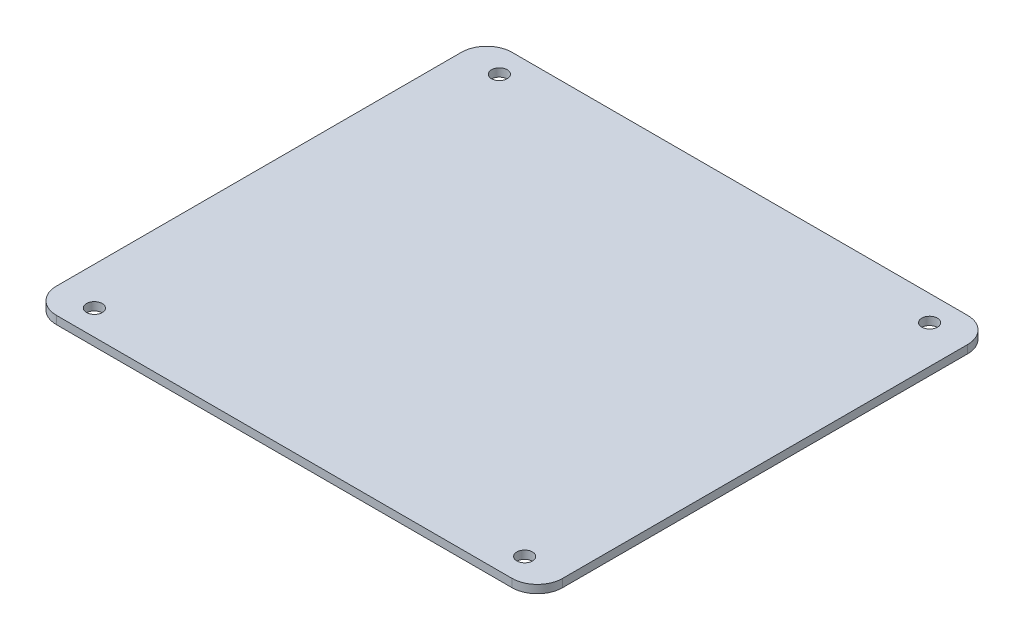
ISO-10303-21;
HEADER;
FILE_DESCRIPTION(('STEP AP214'),'2;1');
FILE_NAME('part.step','',(''),(''),'','','');
FILE_SCHEMA(('AUTOMOTIVE_DESIGN { 1 0 10303 214 1 1 1 1 }'));
ENDSEC;
DATA;
#1=APPLICATION_CONTEXT('core data for automotive mechanical design processes');
#2=APPLICATION_PROTOCOL_DEFINITION('international standard','automotive_design',2000,#1);
#3=PRODUCT_CONTEXT('',#1,'mechanical');
#4=PRODUCT('Part','Part','',(#3));
#5=PRODUCT_RELATED_PRODUCT_CATEGORY('part','',(#4));
#6=PRODUCT_DEFINITION_FORMATION('','',#4);
#7=PRODUCT_DEFINITION_CONTEXT('part definition',#1,'design');
#8=PRODUCT_DEFINITION('design','',#6,#7);
#9=PRODUCT_DEFINITION_SHAPE('','',#8);
#10=(LENGTH_UNIT() NAMED_UNIT(*) SI_UNIT(.MILLI.,.METRE.));
#11=(NAMED_UNIT(*) PLANE_ANGLE_UNIT() SI_UNIT($,.RADIAN.));
#12=(NAMED_UNIT(*) SI_UNIT($,.STERADIAN.) SOLID_ANGLE_UNIT());
#13=UNCERTAINTY_MEASURE_WITH_UNIT(LENGTH_MEASURE(1.E-05),#10,'distance_accuracy_value','');
#14=(GEOMETRIC_REPRESENTATION_CONTEXT(3) GLOBAL_UNCERTAINTY_ASSIGNED_CONTEXT((#13)) GLOBAL_UNIT_ASSIGNED_CONTEXT((#10,
#11,#12)) REPRESENTATION_CONTEXT('',''));
#15=CARTESIAN_POINT('',(0.,0.,0.));
#16=DIRECTION('',(0.,0.,1.));
#17=DIRECTION('',(1.,0.,0.));
#18=AXIS2_PLACEMENT_3D('',#15,#16,#17);
#19=CARTESIAN_POINT('',(0.,1.6,0.));
#20=DIRECTION('',(0.,1.,0.));
#21=DIRECTION('',(0.,0.,1.));
#22=AXIS2_PLACEMENT_3D('',#19,#20,#21);
#23=PLANE('',#22);
#24=CARTESIAN_POINT('',(-42.5,1.6,40.));
#25=DIRECTION('',(0.,1.,0.));
#26=DIRECTION('',(0.,0.,1.));
#27=AXIS2_PLACEMENT_3D('',#24,#25,#26);
#28=CIRCLE('',#27,1.55);
#29=CARTESIAN_POINT('',(-42.5,1.6,41.55));
#30=VERTEX_POINT('',#29);
#31=EDGE_CURVE('E214',#30,#30,#28,.T.);
#32=ORIENTED_EDGE('',*,*,#31,.F.);
#33=EDGE_LOOP('',(#32));
#34=FACE_BOUND('',#33,.T.);
#35=CARTESIAN_POINT('',(-42.5,1.6,-40.));
#36=DIRECTION('',(0.,1.,0.));
#37=DIRECTION('',(0.,0.,1.));
#38=AXIS2_PLACEMENT_3D('',#35,#36,#37);
#39=CIRCLE('',#38,1.55);
#40=CARTESIAN_POINT('',(-42.5,1.6,-38.45));
#41=VERTEX_POINT('',#40);
#42=EDGE_CURVE('E190',#41,#41,#39,.T.);
#43=ORIENTED_EDGE('',*,*,#42,.F.);
#44=EDGE_LOOP('',(#43));
#45=FACE_BOUND('',#44,.T.);
#46=DIRECTION('',(0.,0.,-1.));
#47=VECTOR('',#46,1.);
#48=CARTESIAN_POINT('',(50.,1.6,45.));
#49=LINE('',#48,#47);
#50=CARTESIAN_POINT('',(50.,1.6,40.));
#51=VERTEX_POINT('',#50);
#52=CARTESIAN_POINT('',(50.,1.6,-40.));
#53=VERTEX_POINT('',#52);
#54=EDGE_CURVE('E200',#51,#53,#49,.T.);
#55=ORIENTED_EDGE('',*,*,#54,.T.);
#56=CARTESIAN_POINT('',(45.,1.6,-40.));
#57=DIRECTION('',(0.,1.,0.));
#58=DIRECTION('',(0.,0.,1.));
#59=AXIS2_PLACEMENT_3D('',#56,#57,#58);
#60=CIRCLE('',#59,5.);
#61=CARTESIAN_POINT('',(45.,1.6,-45.));
#62=VERTEX_POINT('',#61);
#63=EDGE_CURVE('E169',#53,#62,#60,.T.);
#64=ORIENTED_EDGE('',*,*,#63,.T.);
#65=DIRECTION('',(-1.,0.,0.));
#66=VECTOR('',#65,1.);
#67=CARTESIAN_POINT('',(50.,1.6,-45.));
#68=LINE('',#67,#66);
#69=CARTESIAN_POINT('',(-45.,1.6,-45.));
#70=VERTEX_POINT('',#69);
#71=EDGE_CURVE('E127',#62,#70,#68,.T.);
#72=ORIENTED_EDGE('',*,*,#71,.T.);
#73=CARTESIAN_POINT('',(-45.,1.6,-40.));
#74=DIRECTION('',(0.,1.,0.));
#75=DIRECTION('',(0.,0.,1.));
#76=AXIS2_PLACEMENT_3D('',#73,#74,#75);
#77=CIRCLE('',#76,5.);
#78=CARTESIAN_POINT('',(-50.,1.6,-40.));
#79=VERTEX_POINT('',#78);
#80=EDGE_CURVE('E161',#70,#79,#77,.T.);
#81=ORIENTED_EDGE('',*,*,#80,.T.);
#82=DIRECTION('',(0.,0.,1.));
#83=VECTOR('',#82,1.);
#84=CARTESIAN_POINT('',(-50.,1.6,45.));
#85=LINE('',#84,#83);
#86=CARTESIAN_POINT('',(-50.,1.6,40.));
#87=VERTEX_POINT('',#86);
#88=EDGE_CURVE('E136',#79,#87,#85,.T.);
#89=ORIENTED_EDGE('',*,*,#88,.T.);
#90=CARTESIAN_POINT('',(-45.,1.6,40.));
#91=DIRECTION('',(0.,1.,0.));
#92=DIRECTION('',(0.,0.,1.));
#93=AXIS2_PLACEMENT_3D('',#90,#91,#92);
#94=CIRCLE('',#93,5.);
#95=CARTESIAN_POINT('',(-45.,1.6,45.));
#96=VERTEX_POINT('',#95);
#97=EDGE_CURVE('E62',#87,#96,#94,.T.);
#98=ORIENTED_EDGE('',*,*,#97,.T.);
#99=DIRECTION('',(1.,0.,0.));
#100=VECTOR('',#99,1.);
#101=CARTESIAN_POINT('',(50.,1.6,45.));
#102=LINE('',#101,#100);
#103=CARTESIAN_POINT('',(45.,1.6,45.));
#104=VERTEX_POINT('',#103);
#105=EDGE_CURVE('E141',#96,#104,#102,.T.);
#106=ORIENTED_EDGE('',*,*,#105,.T.);
#107=CARTESIAN_POINT('',(45.,1.6,40.));
#108=DIRECTION('',(0.,1.,0.));
#109=DIRECTION('',(0.,0.,1.));
#110=AXIS2_PLACEMENT_3D('',#107,#108,#109);
#111=CIRCLE('',#110,5.);
#112=EDGE_CURVE('E166',#104,#51,#111,.T.);
#113=ORIENTED_EDGE('',*,*,#112,.T.);
#114=EDGE_LOOP('',(#55,#64,#72,#81,#89,#98,#106,#113));
#115=FACE_BOUND('',#114,.T.);
#116=CARTESIAN_POINT('',(42.5,1.6,-40.));
#117=DIRECTION('',(0.,1.,0.));
#118=DIRECTION('',(0.,0.,1.));
#119=AXIS2_PLACEMENT_3D('',#116,#117,#118);
#120=CIRCLE('',#119,1.55);
#121=CARTESIAN_POINT('',(42.5,1.6,-38.45));
#122=VERTEX_POINT('',#121);
#123=EDGE_CURVE('E208',#122,#122,#120,.T.);
#124=ORIENTED_EDGE('',*,*,#123,.F.);
#125=EDGE_LOOP('',(#124));
#126=FACE_BOUND('',#125,.T.);
#127=CARTESIAN_POINT('',(42.5,1.6,40.));
#128=DIRECTION('',(0.,1.,0.));
#129=DIRECTION('',(0.,0.,1.));
#130=AXIS2_PLACEMENT_3D('',#127,#128,#129);
#131=CIRCLE('',#130,1.55);
#132=CARTESIAN_POINT('',(42.5,1.6,41.55));
#133=VERTEX_POINT('',#132);
#134=EDGE_CURVE('E222',#133,#133,#131,.T.);
#135=ORIENTED_EDGE('',*,*,#134,.F.);
#136=EDGE_LOOP('',(#135));
#137=FACE_BOUND('',#136,.T.);
#138=ADVANCED_FACE('F39',(#34,#45,#115,#126,#137),#23,.T.);
#139=CARTESIAN_POINT('',(0.,0.,0.));
#140=DIRECTION('',(0.,1.,0.));
#141=DIRECTION('',(0.,0.,1.));
#142=AXIS2_PLACEMENT_3D('',#139,#140,#141);
#143=PLANE('',#142);
#144=DIRECTION('',(-1.,0.,0.));
#145=VECTOR('',#144,1.);
#146=CARTESIAN_POINT('',(50.,0.,-45.));
#147=LINE('',#146,#145);
#148=CARTESIAN_POINT('',(45.,0.,-45.));
#149=VERTEX_POINT('',#148);
#150=CARTESIAN_POINT('',(-45.,0.,-45.));
#151=VERTEX_POINT('',#150);
#152=EDGE_CURVE('E124',#149,#151,#147,.T.);
#153=ORIENTED_EDGE('',*,*,#152,.F.);
#154=CARTESIAN_POINT('',(45.,0.,-40.));
#155=DIRECTION('',(0.,1.,0.));
#156=DIRECTION('',(0.,0.,1.));
#157=AXIS2_PLACEMENT_3D('',#154,#155,#156);
#158=CIRCLE('',#157,5.);
#159=CARTESIAN_POINT('',(50.,0.,-40.));
#160=VERTEX_POINT('',#159);
#161=EDGE_CURVE('E106',#149,#160,#158,.F.);
#162=ORIENTED_EDGE('',*,*,#161,.T.);
#163=DIRECTION('',(0.,0.,-1.));
#164=VECTOR('',#163,1.);
#165=CARTESIAN_POINT('',(50.,0.,45.));
#166=LINE('',#165,#164);
#167=CARTESIAN_POINT('',(50.,0.,40.));
#168=VERTEX_POINT('',#167);
#169=EDGE_CURVE('E137',#168,#160,#166,.T.);
#170=ORIENTED_EDGE('',*,*,#169,.F.);
#171=CARTESIAN_POINT('',(45.,0.,40.));
#172=DIRECTION('',(0.,1.,0.));
#173=DIRECTION('',(0.,0.,1.));
#174=AXIS2_PLACEMENT_3D('',#171,#172,#173);
#175=CIRCLE('',#174,5.);
#176=CARTESIAN_POINT('',(45.,0.,45.));
#177=VERTEX_POINT('',#176);
#178=EDGE_CURVE('E118',#168,#177,#175,.F.);
#179=ORIENTED_EDGE('',*,*,#178,.T.);
#180=DIRECTION('',(1.,0.,0.));
#181=VECTOR('',#180,1.);
#182=CARTESIAN_POINT('',(50.,0.,45.));
#183=LINE('',#182,#181);
#184=CARTESIAN_POINT('',(-45.,0.,45.));
#185=VERTEX_POINT('',#184);
#186=EDGE_CURVE('E143',#185,#177,#183,.T.);
#187=ORIENTED_EDGE('',*,*,#186,.F.);
#188=CARTESIAN_POINT('',(-45.,0.,40.));
#189=DIRECTION('',(0.,1.,0.));
#190=DIRECTION('',(0.,0.,1.));
#191=AXIS2_PLACEMENT_3D('',#188,#189,#190);
#192=CIRCLE('',#191,5.);
#193=CARTESIAN_POINT('',(-50.,0.,40.));
#194=VERTEX_POINT('',#193);
#195=EDGE_CURVE('E151',#185,#194,#192,.F.);
#196=ORIENTED_EDGE('',*,*,#195,.T.);
#197=DIRECTION('',(0.,0.,1.));
#198=VECTOR('',#197,1.);
#199=CARTESIAN_POINT('',(-50.,0.,45.));
#200=LINE('',#199,#198);
#201=CARTESIAN_POINT('',(-50.,0.,-40.));
#202=VERTEX_POINT('',#201);
#203=EDGE_CURVE('E184',#202,#194,#200,.T.);
#204=ORIENTED_EDGE('',*,*,#203,.F.);
#205=CARTESIAN_POINT('',(-45.,0.,-40.));
#206=DIRECTION('',(0.,1.,0.));
#207=DIRECTION('',(0.,0.,1.));
#208=AXIS2_PLACEMENT_3D('',#205,#206,#207);
#209=CIRCLE('',#208,5.);
#210=EDGE_CURVE('E129',#202,#151,#209,.F.);
#211=ORIENTED_EDGE('',*,*,#210,.T.);
#212=EDGE_LOOP('',(#153,#162,#170,#179,#187,#196,#204,#211));
#213=FACE_BOUND('',#212,.T.);
#214=CARTESIAN_POINT('',(-42.5,0.,-40.));
#215=DIRECTION('',(0.,1.,0.));
#216=DIRECTION('',(0.,0.,1.));
#217=AXIS2_PLACEMENT_3D('',#214,#215,#216);
#218=CIRCLE('',#217,1.55);
#219=CARTESIAN_POINT('',(-42.5,0.,-38.45));
#220=VERTEX_POINT('',#219);
#221=EDGE_CURVE('E195',#220,#220,#218,.T.);
#222=ORIENTED_EDGE('',*,*,#221,.T.);
#223=EDGE_LOOP('',(#222));
#224=FACE_BOUND('',#223,.T.);
#225=CARTESIAN_POINT('',(42.5,0.,-40.));
#226=DIRECTION('',(0.,1.,0.));
#227=DIRECTION('',(0.,0.,1.));
#228=AXIS2_PLACEMENT_3D('',#225,#226,#227);
#229=CIRCLE('',#228,1.55);
#230=CARTESIAN_POINT('',(42.5,0.,-38.45));
#231=VERTEX_POINT('',#230);
#232=EDGE_CURVE('E210',#231,#231,#229,.T.);
#233=ORIENTED_EDGE('',*,*,#232,.T.);
#234=EDGE_LOOP('',(#233));
#235=FACE_BOUND('',#234,.T.);
#236=CARTESIAN_POINT('',(-42.5,0.,40.));
#237=DIRECTION('',(0.,1.,0.));
#238=DIRECTION('',(0.,0.,1.));
#239=AXIS2_PLACEMENT_3D('',#236,#237,#238);
#240=CIRCLE('',#239,1.55);
#241=CARTESIAN_POINT('',(-42.5,0.,41.55));
#242=VERTEX_POINT('',#241);
#243=EDGE_CURVE('E218',#242,#242,#240,.T.);
#244=ORIENTED_EDGE('',*,*,#243,.T.);
#245=EDGE_LOOP('',(#244));
#246=FACE_BOUND('',#245,.T.);
#247=CARTESIAN_POINT('',(42.5,0.,40.));
#248=DIRECTION('',(0.,1.,0.));
#249=DIRECTION('',(0.,0.,1.));
#250=AXIS2_PLACEMENT_3D('',#247,#248,#249);
#251=CIRCLE('',#250,1.55);
#252=CARTESIAN_POINT('',(42.5,0.,41.55));
#253=VERTEX_POINT('',#252);
#254=EDGE_CURVE('E226',#253,#253,#251,.T.);
#255=ORIENTED_EDGE('',*,*,#254,.T.);
#256=EDGE_LOOP('',(#255));
#257=FACE_BOUND('',#256,.T.);
#258=ADVANCED_FACE('F132',(#213,#224,#235,#246,#257),#143,.F.);
#259=CARTESIAN_POINT('',(-50.,1.6,45.));
#260=DIRECTION('',(1.,0.,0.));
#261=DIRECTION('',(0.,0.,-1.));
#262=AXIS2_PLACEMENT_3D('',#259,#260,#261);
#263=PLANE('',#262);
#264=ORIENTED_EDGE('',*,*,#203,.T.);
#265=DIRECTION('',(0.,-1.,0.));
#266=VECTOR('',#265,1.);
#267=CARTESIAN_POINT('',(-50.,1.6,40.));
#268=LINE('',#267,#266);
#269=EDGE_CURVE('E11',#194,#87,#268,.F.);
#270=ORIENTED_EDGE('',*,*,#269,.T.);
#271=ORIENTED_EDGE('',*,*,#88,.F.);
#272=DIRECTION('',(0.,-1.,0.));
#273=VECTOR('',#272,1.);
#274=CARTESIAN_POINT('',(-50.,1.6,-40.));
#275=LINE('',#274,#273);
#276=EDGE_CURVE('E48',#79,#202,#275,.T.);
#277=ORIENTED_EDGE('',*,*,#276,.T.);
#278=EDGE_LOOP('',(#264,#270,#271,#277));
#279=FACE_BOUND('',#278,.T.);
#280=ADVANCED_FACE('F183',(#279),#263,.F.);
#281=CARTESIAN_POINT('',(50.,1.6,45.));
#282=DIRECTION('',(0.,0.,-1.));
#283=DIRECTION('',(-1.,0.,0.));
#284=AXIS2_PLACEMENT_3D('',#281,#282,#283);
#285=PLANE('',#284);
#286=ORIENTED_EDGE('',*,*,#186,.T.);
#287=DIRECTION('',(0.,-1.,0.));
#288=VECTOR('',#287,1.);
#289=CARTESIAN_POINT('',(45.,1.6,45.));
#290=LINE('',#289,#288);
#291=EDGE_CURVE('E55',#177,#104,#290,.F.);
#292=ORIENTED_EDGE('',*,*,#291,.T.);
#293=ORIENTED_EDGE('',*,*,#105,.F.);
#294=DIRECTION('',(0.,-1.,0.));
#295=VECTOR('',#294,1.);
#296=CARTESIAN_POINT('',(-45.,1.6,45.));
#297=LINE('',#296,#295);
#298=EDGE_CURVE('E172',#96,#185,#297,.T.);
#299=ORIENTED_EDGE('',*,*,#298,.T.);
#300=EDGE_LOOP('',(#286,#292,#293,#299));
#301=FACE_BOUND('',#300,.T.);
#302=ADVANCED_FACE('F255',(#301),#285,.F.);
#303=CARTESIAN_POINT('',(50.,1.6,45.));
#304=DIRECTION('',(-1.,0.,0.));
#305=DIRECTION('',(0.,0.,1.));
#306=AXIS2_PLACEMENT_3D('',#303,#304,#305);
#307=PLANE('',#306);
#308=ORIENTED_EDGE('',*,*,#169,.T.);
#309=DIRECTION('',(0.,-1.,0.));
#310=VECTOR('',#309,1.);
#311=CARTESIAN_POINT('',(50.,1.6,-40.));
#312=LINE('',#311,#310);
#313=EDGE_CURVE('E111',#160,#53,#312,.F.);
#314=ORIENTED_EDGE('',*,*,#313,.T.);
#315=ORIENTED_EDGE('',*,*,#54,.F.);
#316=DIRECTION('',(0.,-1.,0.));
#317=VECTOR('',#316,1.);
#318=CARTESIAN_POINT('',(50.,1.6,40.));
#319=LINE('',#318,#317);
#320=EDGE_CURVE('E117',#51,#168,#319,.T.);
#321=ORIENTED_EDGE('',*,*,#320,.T.);
#322=EDGE_LOOP('',(#308,#314,#315,#321));
#323=FACE_BOUND('',#322,.T.);
#324=ADVANCED_FACE('F252',(#323),#307,.F.);
#325=CARTESIAN_POINT('',(50.,1.6,-45.));
#326=DIRECTION('',(0.,0.,1.));
#327=DIRECTION('',(1.,0.,0.));
#328=AXIS2_PLACEMENT_3D('',#325,#326,#327);
#329=PLANE('',#328);
#330=ORIENTED_EDGE('',*,*,#71,.F.);
#331=DIRECTION('',(0.,-1.,0.));
#332=VECTOR('',#331,1.);
#333=CARTESIAN_POINT('',(45.,1.6,-45.));
#334=LINE('',#333,#332);
#335=EDGE_CURVE('E110',#62,#149,#334,.T.);
#336=ORIENTED_EDGE('',*,*,#335,.T.);
#337=ORIENTED_EDGE('',*,*,#152,.T.);
#338=DIRECTION('',(0.,-1.,0.));
#339=VECTOR('',#338,1.);
#340=CARTESIAN_POINT('',(-45.,1.6,-45.));
#341=LINE('',#340,#339);
#342=EDGE_CURVE('E130',#151,#70,#341,.F.);
#343=ORIENTED_EDGE('',*,*,#342,.T.);
#344=EDGE_LOOP('',(#330,#336,#337,#343));
#345=FACE_BOUND('',#344,.T.);
#346=ADVANCED_FACE('F123',(#345),#329,.F.);
#347=CARTESIAN_POINT('',(-42.5,1.6,-40.));
#348=DIRECTION('',(0.,-1.,0.));
#349=DIRECTION('',(0.,0.,-1.));
#350=AXIS2_PLACEMENT_3D('',#347,#348,#349);
#351=CYLINDRICAL_SURFACE('',#350,1.55);
#352=ORIENTED_EDGE('',*,*,#42,.T.);
#353=EDGE_LOOP('',(#352));
#354=FACE_BOUND('',#353,.T.);
#355=ORIENTED_EDGE('',*,*,#221,.F.);
#356=EDGE_LOOP('',(#355));
#357=FACE_BOUND('',#356,.T.);
#358=ADVANCED_FACE('F247',(#354,#357),#351,.F.);
#359=CARTESIAN_POINT('',(42.5,1.6,-40.));
#360=DIRECTION('',(0.,-1.,0.));
#361=DIRECTION('',(0.,0.,-1.));
#362=AXIS2_PLACEMENT_3D('',#359,#360,#361);
#363=CYLINDRICAL_SURFACE('',#362,1.55);
#364=ORIENTED_EDGE('',*,*,#123,.T.);
#365=EDGE_LOOP('',(#364));
#366=FACE_BOUND('',#365,.T.);
#367=ORIENTED_EDGE('',*,*,#232,.F.);
#368=EDGE_LOOP('',(#367));
#369=FACE_BOUND('',#368,.T.);
#370=ADVANCED_FACE('F279',(#366,#369),#363,.F.);
#371=CARTESIAN_POINT('',(-42.5,1.6,40.));
#372=DIRECTION('',(0.,-1.,0.));
#373=DIRECTION('',(0.,0.,-1.));
#374=AXIS2_PLACEMENT_3D('',#371,#372,#373);
#375=CYLINDRICAL_SURFACE('',#374,1.55);
#376=ORIENTED_EDGE('',*,*,#31,.T.);
#377=EDGE_LOOP('',(#376));
#378=FACE_BOUND('',#377,.T.);
#379=ORIENTED_EDGE('',*,*,#243,.F.);
#380=EDGE_LOOP('',(#379));
#381=FACE_BOUND('',#380,.T.);
#382=ADVANCED_FACE('F282',(#378,#381),#375,.F.);
#383=CARTESIAN_POINT('',(42.5,1.6,40.));
#384=DIRECTION('',(0.,-1.,0.));
#385=DIRECTION('',(0.,0.,-1.));
#386=AXIS2_PLACEMENT_3D('',#383,#384,#385);
#387=CYLINDRICAL_SURFACE('',#386,1.55);
#388=ORIENTED_EDGE('',*,*,#134,.T.);
#389=EDGE_LOOP('',(#388));
#390=FACE_BOUND('',#389,.T.);
#391=ORIENTED_EDGE('',*,*,#254,.F.);
#392=EDGE_LOOP('',(#391));
#393=FACE_BOUND('',#392,.T.);
#394=ADVANCED_FACE('F234',(#390,#393),#387,.F.);
#395=CARTESIAN_POINT('',(45.,1.6,-40.));
#396=DIRECTION('',(0.,-1.,0.));
#397=DIRECTION('',(0.,0.,-1.));
#398=AXIS2_PLACEMENT_3D('',#395,#396,#397);
#399=CYLINDRICAL_SURFACE('',#398,5.);
#400=ORIENTED_EDGE('',*,*,#63,.F.);
#401=ORIENTED_EDGE('',*,*,#313,.F.);
#402=ORIENTED_EDGE('',*,*,#161,.F.);
#403=ORIENTED_EDGE('',*,*,#335,.F.);
#404=EDGE_LOOP('',(#400,#401,#402,#403));
#405=FACE_BOUND('',#404,.T.);
#406=ADVANCED_FACE('F109',(#405),#399,.T.);
#407=CARTESIAN_POINT('',(45.,1.6,40.));
#408=DIRECTION('',(0.,-1.,0.));
#409=DIRECTION('',(0.,0.,-1.));
#410=AXIS2_PLACEMENT_3D('',#407,#408,#409);
#411=CYLINDRICAL_SURFACE('',#410,5.);
#412=ORIENTED_EDGE('',*,*,#112,.F.);
#413=ORIENTED_EDGE('',*,*,#291,.F.);
#414=ORIENTED_EDGE('',*,*,#178,.F.);
#415=ORIENTED_EDGE('',*,*,#320,.F.);
#416=EDGE_LOOP('',(#412,#413,#414,#415));
#417=FACE_BOUND('',#416,.T.);
#418=ADVANCED_FACE('F263',(#417),#411,.T.);
#419=CARTESIAN_POINT('',(-45.,1.6,40.));
#420=DIRECTION('',(0.,-1.,0.));
#421=DIRECTION('',(0.,0.,-1.));
#422=AXIS2_PLACEMENT_3D('',#419,#420,#421);
#423=CYLINDRICAL_SURFACE('',#422,5.);
#424=ORIENTED_EDGE('',*,*,#97,.F.);
#425=ORIENTED_EDGE('',*,*,#269,.F.);
#426=ORIENTED_EDGE('',*,*,#195,.F.);
#427=ORIENTED_EDGE('',*,*,#298,.F.);
#428=EDGE_LOOP('',(#424,#425,#426,#427));
#429=FACE_BOUND('',#428,.T.);
#430=ADVANCED_FACE('F265',(#429),#423,.T.);
#431=CARTESIAN_POINT('',(-45.,1.6,-40.));
#432=DIRECTION('',(0.,-1.,0.));
#433=DIRECTION('',(0.,0.,-1.));
#434=AXIS2_PLACEMENT_3D('',#431,#432,#433);
#435=CYLINDRICAL_SURFACE('',#434,5.);
#436=ORIENTED_EDGE('',*,*,#80,.F.);
#437=ORIENTED_EDGE('',*,*,#342,.F.);
#438=ORIENTED_EDGE('',*,*,#210,.F.);
#439=ORIENTED_EDGE('',*,*,#276,.F.);
#440=EDGE_LOOP('',(#436,#437,#438,#439));
#441=FACE_BOUND('',#440,.T.);
#442=ADVANCED_FACE('F41',(#441),#435,.T.);
#443=CLOSED_SHELL('',(#138,#258,#280,#302,#324,#346,#358,#370,#382,#394,#406,#418,#430,#442));
#444=MANIFOLD_SOLID_BREP('B2',#443);
#445=ADVANCED_BREP_SHAPE_REPRESENTATION('',(#18,#444),#14);
#446=SHAPE_DEFINITION_REPRESENTATION(#9,#445);
ENDSEC;
END-ISO-10303-21;
